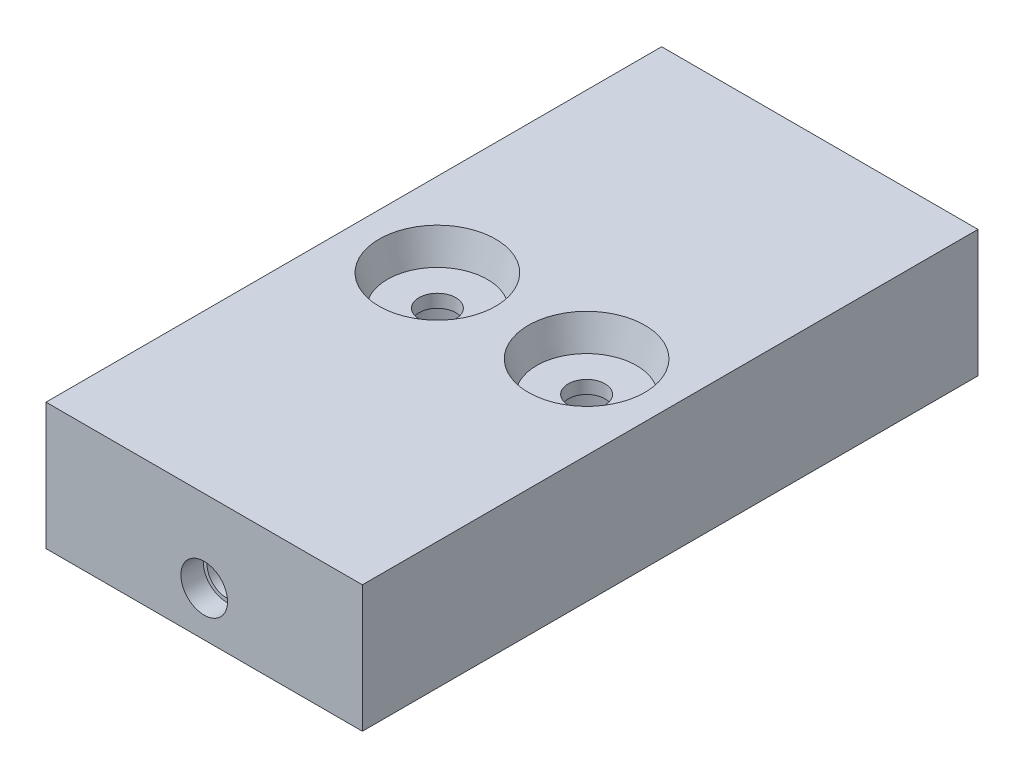
ISO-10303-21;
HEADER;
FILE_DESCRIPTION(('STEP AP214'),'2;1');
FILE_NAME('part.step','',(''),(''),'','','');
FILE_SCHEMA(('AUTOMOTIVE_DESIGN { 1 0 10303 214 1 1 1 1 }'));
ENDSEC;
DATA;
#1=APPLICATION_CONTEXT('core data for automotive mechanical design processes');
#2=APPLICATION_PROTOCOL_DEFINITION('international standard','automotive_design',2000,#1);
#3=PRODUCT_CONTEXT('',#1,'mechanical');
#4=PRODUCT('Part','Part','',(#3));
#5=PRODUCT_RELATED_PRODUCT_CATEGORY('part','',(#4));
#6=PRODUCT_DEFINITION_FORMATION('','',#4);
#7=PRODUCT_DEFINITION_CONTEXT('part definition',#1,'design');
#8=PRODUCT_DEFINITION('design','',#6,#7);
#9=PRODUCT_DEFINITION_SHAPE('','',#8);
#10=(LENGTH_UNIT() NAMED_UNIT(*) SI_UNIT(.MILLI.,.METRE.));
#11=(NAMED_UNIT(*) PLANE_ANGLE_UNIT() SI_UNIT($,.RADIAN.));
#12=(NAMED_UNIT(*) SI_UNIT($,.STERADIAN.) SOLID_ANGLE_UNIT());
#13=UNCERTAINTY_MEASURE_WITH_UNIT(LENGTH_MEASURE(1.E-05),#10,'distance_accuracy_value','');
#14=(GEOMETRIC_REPRESENTATION_CONTEXT(3) GLOBAL_UNCERTAINTY_ASSIGNED_CONTEXT((#13)) GLOBAL_UNIT_ASSIGNED_CONTEXT((#10,
#11,#12)) REPRESENTATION_CONTEXT('',''));
#15=CARTESIAN_POINT('',(0.,0.,0.));
#16=DIRECTION('',(0.,0.,1.));
#17=DIRECTION('',(1.,0.,0.));
#18=AXIS2_PLACEMENT_3D('',#15,#16,#17);
#19=CARTESIAN_POINT('',(0.,-1.75,0.));
#20=DIRECTION('',(0.,1.,0.));
#21=DIRECTION('',(0.,0.,1.));
#22=AXIS2_PLACEMENT_3D('',#19,#20,#21);
#23=PLANE('',#22);
#24=CARTESIAN_POINT('',(20.,-1.75,0.));
#25=DIRECTION('',(0.,1.,0.));
#26=DIRECTION('',(0.,0.,1.));
#27=AXIS2_PLACEMENT_3D('',#24,#25,#26);
#28=CIRCLE('',#27,4.92500000000001);
#29=CARTESIAN_POINT('',(20.,-1.75,4.92500000000001));
#30=VERTEX_POINT('',#29);
#31=EDGE_CURVE('E147',#30,#30,#28,.T.);
#32=ORIENTED_EDGE('',*,*,#31,.T.);
#33=EDGE_LOOP('',(#32));
#34=FACE_BOUND('',#33,.T.);
#35=CARTESIAN_POINT('',(20.,-1.75,0.));
#36=DIRECTION('',(0.,1.,0.));
#37=DIRECTION('',(0.,0.,1.));
#38=AXIS2_PLACEMENT_3D('',#35,#36,#37);
#39=CIRCLE('',#38,13.4);
#40=CARTESIAN_POINT('',(20.,-1.75,13.4));
#41=VERTEX_POINT('',#40);
#42=EDGE_CURVE('E131',#41,#41,#39,.F.);
#43=ORIENTED_EDGE('',*,*,#42,.T.);
#44=EDGE_LOOP('',(#43));
#45=FACE_BOUND('',#44,.T.);
#46=ADVANCED_FACE('F46',(#34,#45),#23,.F.);
#47=CARTESIAN_POINT('',(0.,1.75,0.));
#48=DIRECTION('',(0.,1.,0.));
#49=DIRECTION('',(0.,0.,1.));
#50=AXIS2_PLACEMENT_3D('',#47,#48,#49);
#51=PLANE('',#50);
#52=CARTESIAN_POINT('',(20.,1.75,0.));
#53=DIRECTION('',(0.,1.,0.));
#54=DIRECTION('',(0.,0.,1.));
#55=AXIS2_PLACEMENT_3D('',#52,#53,#54);
#56=CIRCLE('',#55,4.92500000000001);
#57=CARTESIAN_POINT('',(20.,1.75,4.92500000000001));
#58=VERTEX_POINT('',#57);
#59=EDGE_CURVE('E140',#58,#58,#56,.T.);
#60=ORIENTED_EDGE('',*,*,#59,.F.);
#61=EDGE_LOOP('',(#60));
#62=FACE_BOUND('',#61,.T.);
#63=CARTESIAN_POINT('',(20.,1.75,0.));
#64=DIRECTION('',(0.,1.,0.));
#65=DIRECTION('',(0.,0.,1.));
#66=AXIS2_PLACEMENT_3D('',#63,#64,#65);
#67=CIRCLE('',#66,13.4);
#68=CARTESIAN_POINT('',(20.,1.75,13.4));
#69=VERTEX_POINT('',#68);
#70=EDGE_CURVE('E150',#69,#69,#67,.T.);
#71=ORIENTED_EDGE('',*,*,#70,.T.);
#72=EDGE_LOOP('',(#71));
#73=FACE_BOUND('',#72,.T.);
#74=ADVANCED_FACE('F184',(#62,#73),#51,.T.);
#75=CARTESIAN_POINT('',(42.4,1.75,0.));
#76=DIRECTION('',(1.,0.,0.));
#77=DIRECTION('',(0.,0.,-1.));
#78=AXIS2_PLACEMENT_3D('',#75,#76,#77);
#79=PLANE('',#78);
#80=DIRECTION('',(0.,-1.,0.));
#81=VECTOR('',#80,1.);
#82=CARTESIAN_POINT('',(42.4,1.75,82.5));
#83=LINE('',#82,#81);
#84=CARTESIAN_POINT('',(42.4,10.,82.5));
#85=VERTEX_POINT('',#84);
#86=CARTESIAN_POINT('',(42.4,-24.,82.5));
#87=VERTEX_POINT('',#86);
#88=EDGE_CURVE('E63',#85,#87,#83,.T.);
#89=ORIENTED_EDGE('',*,*,#88,.T.);
#90=DIRECTION('',(0.,0.,1.));
#91=VECTOR('',#90,1.);
#92=CARTESIAN_POINT('',(42.4,-24.,0.));
#93=LINE('',#92,#91);
#94=CARTESIAN_POINT('',(42.4,-24.,-82.5));
#95=VERTEX_POINT('',#94);
#96=EDGE_CURVE('E111',#95,#87,#93,.T.);
#97=ORIENTED_EDGE('',*,*,#96,.F.);
#98=DIRECTION('',(0.,-1.,0.));
#99=VECTOR('',#98,1.);
#100=CARTESIAN_POINT('',(42.4,1.75,-82.5));
#101=LINE('',#100,#99);
#102=CARTESIAN_POINT('',(42.4,10.,-82.5));
#103=VERTEX_POINT('',#102);
#104=EDGE_CURVE('E93',#103,#95,#101,.T.);
#105=ORIENTED_EDGE('',*,*,#104,.F.);
#106=DIRECTION('',(0.,0.,1.));
#107=VECTOR('',#106,1.);
#108=CARTESIAN_POINT('',(42.4,10.,0.));
#109=LINE('',#108,#107);
#110=EDGE_CURVE('E132',#103,#85,#109,.T.);
#111=ORIENTED_EDGE('',*,*,#110,.T.);
#112=EDGE_LOOP('',(#89,#97,#105,#111));
#113=FACE_BOUND('',#112,.T.);
#114=ADVANCED_FACE('F114',(#113),#79,.T.);
#115=CARTESIAN_POINT('',(0.,1.75,-82.5));
#116=DIRECTION('',(0.,0.,-1.));
#117=DIRECTION('',(-1.,0.,0.));
#118=AXIS2_PLACEMENT_3D('',#115,#116,#117);
#119=PLANE('',#118);
#120=CARTESIAN_POINT('',(0.,-12.,-82.5));
#121=DIRECTION('',(0.,0.,1.));
#122=DIRECTION('',(1.,0.,0.));
#123=AXIS2_PLACEMENT_3D('',#120,#121,#122);
#124=CIRCLE('',#123,6.25);
#125=CARTESIAN_POINT('',(6.25,-12.,-82.5));
#126=VERTEX_POINT('',#125);
#127=EDGE_CURVE('E528',#126,#126,#124,.T.);
#128=ORIENTED_EDGE('',*,*,#127,.T.);
#129=EDGE_LOOP('',(#128));
#130=FACE_BOUND('',#129,.T.);
#131=ORIENTED_EDGE('',*,*,#104,.T.);
#132=DIRECTION('',(1.,0.,0.));
#133=VECTOR('',#132,1.);
#134=CARTESIAN_POINT('',(0.,-24.,-82.5));
#135=LINE('',#134,#133);
#136=CARTESIAN_POINT('',(-42.4,-24.,-82.5));
#137=VERTEX_POINT('',#136);
#138=EDGE_CURVE('E96',#137,#95,#135,.T.);
#139=ORIENTED_EDGE('',*,*,#138,.F.);
#140=DIRECTION('',(0.,-1.,0.));
#141=VECTOR('',#140,1.);
#142=CARTESIAN_POINT('',(-42.4,1.75,-82.5));
#143=LINE('',#142,#141);
#144=CARTESIAN_POINT('',(-42.4,10.,-82.5));
#145=VERTEX_POINT('',#144);
#146=EDGE_CURVE('E104',#145,#137,#143,.T.);
#147=ORIENTED_EDGE('',*,*,#146,.F.);
#148=DIRECTION('',(1.,0.,0.));
#149=VECTOR('',#148,1.);
#150=CARTESIAN_POINT('',(0.,10.,-82.5));
#151=LINE('',#150,#149);
#152=EDGE_CURVE('E99',#145,#103,#151,.T.);
#153=ORIENTED_EDGE('',*,*,#152,.T.);
#154=EDGE_LOOP('',(#131,#139,#147,#153));
#155=FACE_BOUND('',#154,.T.);
#156=ADVANCED_FACE('F95',(#130,#155),#119,.T.);
#157=CARTESIAN_POINT('',(-42.4,1.75,0.));
#158=DIRECTION('',(1.,0.,0.));
#159=DIRECTION('',(0.,0.,-1.));
#160=AXIS2_PLACEMENT_3D('',#157,#158,#159);
#161=PLANE('',#160);
#162=ORIENTED_EDGE('',*,*,#146,.T.);
#163=DIRECTION('',(0.,0.,1.));
#164=VECTOR('',#163,1.);
#165=CARTESIAN_POINT('',(-42.4,-24.,0.));
#166=LINE('',#165,#164);
#167=CARTESIAN_POINT('',(-42.4,-24.,82.5));
#168=VERTEX_POINT('',#167);
#169=EDGE_CURVE('E112',#137,#168,#166,.T.);
#170=ORIENTED_EDGE('',*,*,#169,.T.);
#171=DIRECTION('',(0.,-1.,0.));
#172=VECTOR('',#171,1.);
#173=CARTESIAN_POINT('',(-42.4,1.75,82.5));
#174=LINE('',#173,#172);
#175=CARTESIAN_POINT('',(-42.4,10.,82.5));
#176=VERTEX_POINT('',#175);
#177=EDGE_CURVE('E73',#176,#168,#174,.T.);
#178=ORIENTED_EDGE('',*,*,#177,.F.);
#179=DIRECTION('',(0.,0.,1.));
#180=VECTOR('',#179,1.);
#181=CARTESIAN_POINT('',(-42.4,10.,0.));
#182=LINE('',#181,#180);
#183=EDGE_CURVE('E135',#145,#176,#182,.T.);
#184=ORIENTED_EDGE('',*,*,#183,.F.);
#185=EDGE_LOOP('',(#162,#170,#178,#184));
#186=FACE_BOUND('',#185,.T.);
#187=ADVANCED_FACE('F217',(#186),#161,.F.);
#188=CARTESIAN_POINT('',(20.,1.75,0.));
#189=DIRECTION('',(0.,-1.,0.));
#190=DIRECTION('',(0.,0.,-1.));
#191=AXIS2_PLACEMENT_3D('',#188,#189,#190);
#192=CYLINDRICAL_SURFACE('',#191,4.92500000000001);
#193=ORIENTED_EDGE('',*,*,#59,.T.);
#194=EDGE_LOOP('',(#193));
#195=FACE_BOUND('',#194,.T.);
#196=ORIENTED_EDGE('',*,*,#31,.F.);
#197=EDGE_LOOP('',(#196));
#198=FACE_BOUND('',#197,.T.);
#199=ADVANCED_FACE('F212',(#195,#198),#192,.F.);
#200=CARTESIAN_POINT('',(0.,1.75,82.5));
#201=DIRECTION('',(0.,0.,-1.));
#202=DIRECTION('',(-1.,0.,0.));
#203=AXIS2_PLACEMENT_3D('',#200,#201,#202);
#204=PLANE('',#203);
#205=CARTESIAN_POINT('',(0.,-12.,82.5));
#206=DIRECTION('',(0.,0.,1.));
#207=DIRECTION('',(1.,0.,0.));
#208=AXIS2_PLACEMENT_3D('',#205,#206,#207);
#209=CIRCLE('',#208,6.25);
#210=CARTESIAN_POINT('',(6.25,-12.,82.5));
#211=VERTEX_POINT('',#210);
#212=EDGE_CURVE('E115',#211,#211,#209,.T.);
#213=ORIENTED_EDGE('',*,*,#212,.F.);
#214=EDGE_LOOP('',(#213));
#215=FACE_BOUND('',#214,.T.);
#216=ORIENTED_EDGE('',*,*,#177,.T.);
#217=DIRECTION('',(1.,0.,0.));
#218=VECTOR('',#217,1.);
#219=CARTESIAN_POINT('',(0.,-24.,82.5));
#220=LINE('',#219,#218);
#221=EDGE_CURVE('E123',#168,#87,#220,.T.);
#222=ORIENTED_EDGE('',*,*,#221,.T.);
#223=ORIENTED_EDGE('',*,*,#88,.F.);
#224=DIRECTION('',(1.,0.,0.));
#225=VECTOR('',#224,1.);
#226=CARTESIAN_POINT('',(0.,10.,82.5));
#227=LINE('',#226,#225);
#228=EDGE_CURVE('E137',#176,#85,#227,.T.);
#229=ORIENTED_EDGE('',*,*,#228,.F.);
#230=EDGE_LOOP('',(#216,#222,#223,#229));
#231=FACE_BOUND('',#230,.T.);
#232=ADVANCED_FACE('F207',(#215,#231),#204,.F.);
#233=CARTESIAN_POINT('',(-20.,1.75,0.));
#234=DIRECTION('',(0.,-1.,0.));
#235=DIRECTION('',(0.,0.,-1.));
#236=AXIS2_PLACEMENT_3D('',#233,#234,#235);
#237=CYLINDRICAL_SURFACE('',#236,4.925);
#238=CARTESIAN_POINT('',(-20.,1.75,0.));
#239=DIRECTION('',(0.,1.,0.));
#240=DIRECTION('',(0.,0.,1.));
#241=AXIS2_PLACEMENT_3D('',#238,#239,#240);
#242=CIRCLE('',#241,4.925);
#243=CARTESIAN_POINT('',(-20.,1.75,4.925));
#244=VERTEX_POINT('',#243);
#245=EDGE_CURVE('E143',#244,#244,#242,.T.);
#246=ORIENTED_EDGE('',*,*,#245,.T.);
#247=EDGE_LOOP('',(#246));
#248=FACE_BOUND('',#247,.T.);
#249=CARTESIAN_POINT('',(-20.,-1.75,0.));
#250=DIRECTION('',(0.,1.,0.));
#251=DIRECTION('',(0.,0.,1.));
#252=AXIS2_PLACEMENT_3D('',#249,#250,#251);
#253=CIRCLE('',#252,4.925);
#254=CARTESIAN_POINT('',(-20.,-1.75,4.925));
#255=VERTEX_POINT('',#254);
#256=EDGE_CURVE('E144',#255,#255,#253,.T.);
#257=ORIENTED_EDGE('',*,*,#256,.F.);
#258=EDGE_LOOP('',(#257));
#259=FACE_BOUND('',#258,.T.);
#260=ADVANCED_FACE('F200',(#248,#259),#237,.F.);
#261=CARTESIAN_POINT('',(-20.,1.75,0.));
#262=DIRECTION('',(0.,1.,0.));
#263=DIRECTION('',(0.,0.,1.));
#264=AXIS2_PLACEMENT_3D('',#261,#262,#263);
#265=CIRCLE('',#264,13.4);
#266=CARTESIAN_POINT('',(-20.,1.75,13.4));
#267=VERTEX_POINT('',#266);
#268=EDGE_CURVE('E55',#267,#267,#265,.F.);
#269=ORIENTED_EDGE('',*,*,#268,.F.);
#270=EDGE_LOOP('',(#269));
#271=FACE_BOUND('',#270,.T.);
#272=ORIENTED_EDGE('',*,*,#245,.F.);
#273=EDGE_LOOP('',(#272));
#274=FACE_BOUND('',#273,.T.);
#275=ADVANCED_FACE('F192',(#271,#274),#51,.T.);
#276=CARTESIAN_POINT('',(-20.,-1.75,0.));
#277=DIRECTION('',(0.,1.,0.));
#278=DIRECTION('',(0.,0.,1.));
#279=AXIS2_PLACEMENT_3D('',#276,#277,#278);
#280=CIRCLE('',#279,13.4);
#281=CARTESIAN_POINT('',(-20.,-1.75,13.4));
#282=VERTEX_POINT('',#281);
#283=EDGE_CURVE('E12',#282,#282,#280,.T.);
#284=ORIENTED_EDGE('',*,*,#283,.F.);
#285=EDGE_LOOP('',(#284));
#286=FACE_BOUND('',#285,.T.);
#287=ORIENTED_EDGE('',*,*,#256,.T.);
#288=EDGE_LOOP('',(#287));
#289=FACE_BOUND('',#288,.T.);
#290=ADVANCED_FACE('F180',(#286,#289),#23,.F.);
#291=CARTESIAN_POINT('',(-20.,1.75,0.));
#292=DIRECTION('',(0.,1.,0.));
#293=DIRECTION('',(0.,0.,1.));
#294=AXIS2_PLACEMENT_3D('',#291,#292,#293);
#295=CONICAL_SURFACE('',#294,13.4,0.26179938779915);
#296=ORIENTED_EDGE('',*,*,#268,.T.);
#297=EDGE_LOOP('',(#296));
#298=FACE_BOUND('',#297,.T.);
#299=CARTESIAN_POINT('',(-20.,10.,0.));
#300=DIRECTION('',(0.,1.,0.));
#301=DIRECTION('',(0.,0.,1.));
#302=AXIS2_PLACEMENT_3D('',#299,#300,#301);
#303=CIRCLE('',#302,15.6105808375568);
#304=CARTESIAN_POINT('',(-20.,10.,15.6105808375568));
#305=VERTEX_POINT('',#304);
#306=EDGE_CURVE('E139',#305,#305,#303,.T.);
#307=ORIENTED_EDGE('',*,*,#306,.T.);
#308=EDGE_LOOP('',(#307));
#309=FACE_BOUND('',#308,.T.);
#310=ADVANCED_FACE('F171',(#298,#309),#295,.F.);
#311=CARTESIAN_POINT('',(20.,1.75,0.));
#312=DIRECTION('',(0.,1.,0.));
#313=DIRECTION('',(0.,0.,1.));
#314=AXIS2_PLACEMENT_3D('',#311,#312,#313);
#315=CONICAL_SURFACE('',#314,13.4,0.26179938779915);
#316=ORIENTED_EDGE('',*,*,#70,.F.);
#317=EDGE_LOOP('',(#316));
#318=FACE_BOUND('',#317,.T.);
#319=CARTESIAN_POINT('',(20.,10.,0.));
#320=DIRECTION('',(0.,1.,0.));
#321=DIRECTION('',(0.,0.,1.));
#322=AXIS2_PLACEMENT_3D('',#319,#320,#321);
#323=CIRCLE('',#322,15.6105808375568);
#324=CARTESIAN_POINT('',(20.,10.,15.6105808375568));
#325=VERTEX_POINT('',#324);
#326=EDGE_CURVE('E50',#325,#325,#323,.F.);
#327=ORIENTED_EDGE('',*,*,#326,.F.);
#328=EDGE_LOOP('',(#327));
#329=FACE_BOUND('',#328,.T.);
#330=ADVANCED_FACE('F48',(#318,#329),#315,.F.);
#331=CARTESIAN_POINT('',(0.,10.,0.));
#332=DIRECTION('',(0.,1.,0.));
#333=DIRECTION('',(0.,0.,1.));
#334=AXIS2_PLACEMENT_3D('',#331,#332,#333);
#335=PLANE('',#334);
#336=ORIENTED_EDGE('',*,*,#110,.F.);
#337=ORIENTED_EDGE('',*,*,#152,.F.);
#338=ORIENTED_EDGE('',*,*,#183,.T.);
#339=ORIENTED_EDGE('',*,*,#228,.T.);
#340=EDGE_LOOP('',(#336,#337,#338,#339));
#341=FACE_BOUND('',#340,.T.);
#342=ORIENTED_EDGE('',*,*,#306,.F.);
#343=EDGE_LOOP('',(#342));
#344=FACE_BOUND('',#343,.T.);
#345=ORIENTED_EDGE('',*,*,#326,.T.);
#346=EDGE_LOOP('',(#345));
#347=FACE_BOUND('',#346,.T.);
#348=ADVANCED_FACE('F168',(#341,#344,#347),#335,.T.);
#349=CARTESIAN_POINT('',(-20.,-24.,0.));
#350=DIRECTION('',(0.,1.,0.));
#351=DIRECTION('',(0.,0.,1.));
#352=AXIS2_PLACEMENT_3D('',#349,#350,#351);
#353=CYLINDRICAL_SURFACE('',#352,13.4);
#354=CARTESIAN_POINT('',(-20.,-24.,0.));
#355=DIRECTION('',(0.,1.,0.));
#356=DIRECTION('',(0.,0.,1.));
#357=AXIS2_PLACEMENT_3D('',#354,#355,#356);
#358=CIRCLE('',#357,13.4);
#359=CARTESIAN_POINT('',(-20.,-24.,13.4));
#360=VERTEX_POINT('',#359);
#361=EDGE_CURVE('E125',#360,#360,#358,.T.);
#362=ORIENTED_EDGE('',*,*,#361,.F.);
#363=EDGE_LOOP('',(#362));
#364=FACE_BOUND('',#363,.T.);
#365=ORIENTED_EDGE('',*,*,#283,.T.);
#366=EDGE_LOOP('',(#365));
#367=FACE_BOUND('',#366,.T.);
#368=ADVANCED_FACE('F177',(#364,#367),#353,.F.);
#369=CARTESIAN_POINT('',(20.,-24.,0.));
#370=DIRECTION('',(0.,1.,0.));
#371=DIRECTION('',(0.,0.,1.));
#372=AXIS2_PLACEMENT_3D('',#369,#370,#371);
#373=CYLINDRICAL_SURFACE('',#372,13.4);
#374=CARTESIAN_POINT('',(20.,-24.,0.));
#375=DIRECTION('',(0.,1.,0.));
#376=DIRECTION('',(0.,0.,1.));
#377=AXIS2_PLACEMENT_3D('',#374,#375,#376);
#378=CIRCLE('',#377,13.4);
#379=CARTESIAN_POINT('',(20.,-24.,13.4));
#380=VERTEX_POINT('',#379);
#381=EDGE_CURVE('E128',#380,#380,#378,.F.);
#382=ORIENTED_EDGE('',*,*,#381,.T.);
#383=EDGE_LOOP('',(#382));
#384=FACE_BOUND('',#383,.T.);
#385=ORIENTED_EDGE('',*,*,#42,.F.);
#386=EDGE_LOOP('',(#385));
#387=FACE_BOUND('',#386,.T.);
#388=ADVANCED_FACE('F394',(#384,#387),#373,.F.);
#389=CARTESIAN_POINT('',(0.,-24.,0.));
#390=DIRECTION('',(0.,1.,0.));
#391=DIRECTION('',(0.,0.,1.));
#392=AXIS2_PLACEMENT_3D('',#389,#390,#391);
#393=PLANE('',#392);
#394=ORIENTED_EDGE('',*,*,#96,.T.);
#395=ORIENTED_EDGE('',*,*,#221,.F.);
#396=ORIENTED_EDGE('',*,*,#169,.F.);
#397=ORIENTED_EDGE('',*,*,#138,.T.);
#398=EDGE_LOOP('',(#394,#395,#396,#397));
#399=FACE_BOUND('',#398,.T.);
#400=ORIENTED_EDGE('',*,*,#361,.T.);
#401=EDGE_LOOP('',(#400));
#402=FACE_BOUND('',#401,.T.);
#403=ORIENTED_EDGE('',*,*,#381,.F.);
#404=EDGE_LOOP('',(#403));
#405=FACE_BOUND('',#404,.T.);
#406=ADVANCED_FACE('F108',(#399,#402,#405),#393,.F.);
#407=CARTESIAN_POINT('',(0.,-12.,82.5));
#408=DIRECTION('',(0.,0.,1.));
#409=DIRECTION('',(1.,0.,0.));
#410=AXIS2_PLACEMENT_3D('',#407,#408,#409);
#411=CYLINDRICAL_SURFACE('',#410,6.25);
#412=ORIENTED_EDGE('',*,*,#212,.T.);
#413=EDGE_LOOP('',(#412));
#414=FACE_BOUND('',#413,.T.);
#415=CARTESIAN_POINT('',(0.,-12.,76.5));
#416=DIRECTION('',(0.,0.,1.));
#417=DIRECTION('',(1.,0.,0.));
#418=AXIS2_PLACEMENT_3D('',#415,#416,#417);
#419=CIRCLE('',#418,6.25);
#420=CARTESIAN_POINT('',(6.25,-12.,76.5));
#421=VERTEX_POINT('',#420);
#422=EDGE_CURVE('E118',#421,#421,#419,.T.);
#423=ORIENTED_EDGE('',*,*,#422,.F.);
#424=EDGE_LOOP('',(#423));
#425=FACE_BOUND('',#424,.T.);
#426=ADVANCED_FACE('F260',(#414,#425),#411,.F.);
#427=CARTESIAN_POINT('',(-6.25,-12.,76.5));
#428=DIRECTION('',(0.,0.,1.));
#429=DIRECTION('',(1.,0.,0.));
#430=AXIS2_PLACEMENT_3D('',#427,#428,#429);
#431=PLANE('',#430);
#432=ORIENTED_EDGE('',*,*,#422,.T.);
#433=EDGE_LOOP('',(#432));
#434=FACE_BOUND('',#433,.T.);
#435=CARTESIAN_POINT('',(0.,-12.,76.5));
#436=DIRECTION('',(0.,0.,1.));
#437=DIRECTION('',(1.,0.,0.));
#438=AXIS2_PLACEMENT_3D('',#435,#436,#437);
#439=CIRCLE('',#438,5.25);
#440=CARTESIAN_POINT('',(5.25,-12.,76.5));
#441=VERTEX_POINT('',#440);
#442=EDGE_CURVE('E540',#441,#441,#439,.T.);
#443=ORIENTED_EDGE('',*,*,#442,.F.);
#444=EDGE_LOOP('',(#443));
#445=FACE_BOUND('',#444,.T.);
#446=ADVANCED_FACE('F265',(#434,#445),#431,.T.);
#447=CARTESIAN_POINT('',(0.,-12.,82.5));
#448=DIRECTION('',(0.,0.,1.));
#449=DIRECTION('',(1.,0.,0.));
#450=AXIS2_PLACEMENT_3D('',#447,#448,#449);
#451=CYLINDRICAL_SURFACE('',#450,5.25);
#452=ORIENTED_EDGE('',*,*,#442,.T.);
#453=EDGE_LOOP('',(#452));
#454=FACE_BOUND('',#453,.T.);
#455=CARTESIAN_POINT('',(0.,-12.,61.5));
#456=DIRECTION('',(0.,0.,1.));
#457=DIRECTION('',(1.,0.,0.));
#458=AXIS2_PLACEMENT_3D('',#455,#456,#457);
#459=CIRCLE('',#458,5.25);
#460=CARTESIAN_POINT('',(5.25,-12.,61.5));
#461=VERTEX_POINT('',#460);
#462=EDGE_CURVE('E537',#461,#461,#459,.T.);
#463=ORIENTED_EDGE('',*,*,#462,.F.);
#464=EDGE_LOOP('',(#463));
#465=FACE_BOUND('',#464,.T.);
#466=ADVANCED_FACE('F275',(#454,#465),#451,.F.);
#467=CARTESIAN_POINT('',(-5.25,-12.,61.5));
#468=DIRECTION('',(0.,0.,1.));
#469=DIRECTION('',(1.,0.,0.));
#470=AXIS2_PLACEMENT_3D('',#467,#468,#469);
#471=PLANE('',#470);
#472=ORIENTED_EDGE('',*,*,#462,.T.);
#473=EDGE_LOOP('',(#472));
#474=FACE_BOUND('',#473,.T.);
#475=CARTESIAN_POINT('',(0.,-12.,61.5));
#476=DIRECTION('',(0.,0.,1.));
#477=DIRECTION('',(1.,0.,0.));
#478=AXIS2_PLACEMENT_3D('',#475,#476,#477);
#479=CIRCLE('',#478,4.05);
#480=CARTESIAN_POINT('',(4.05,-12.,61.5));
#481=VERTEX_POINT('',#480);
#482=EDGE_CURVE('E534',#481,#481,#479,.T.);
#483=ORIENTED_EDGE('',*,*,#482,.F.);
#484=EDGE_LOOP('',(#483));
#485=FACE_BOUND('',#484,.T.);
#486=ADVANCED_FACE('F285',(#474,#485),#471,.T.);
#487=CARTESIAN_POINT('',(0.,-12.,82.5));
#488=DIRECTION('',(0.,0.,1.));
#489=DIRECTION('',(1.,0.,0.));
#490=AXIS2_PLACEMENT_3D('',#487,#488,#489);
#491=CYLINDRICAL_SURFACE('',#490,4.05);
#492=ORIENTED_EDGE('',*,*,#482,.T.);
#493=EDGE_LOOP('',(#492));
#494=FACE_BOUND('',#493,.T.);
#495=CARTESIAN_POINT('',(0.,-12.,47.5));
#496=DIRECTION('',(0.,0.,1.));
#497=DIRECTION('',(1.,0.,0.));
#498=AXIS2_PLACEMENT_3D('',#495,#496,#497);
#499=CIRCLE('',#498,4.05);
#500=CARTESIAN_POINT('',(4.05,-12.,47.5));
#501=VERTEX_POINT('',#500);
#502=EDGE_CURVE('E531',#501,#501,#499,.T.);
#503=ORIENTED_EDGE('',*,*,#502,.F.);
#504=EDGE_LOOP('',(#503));
#505=FACE_BOUND('',#504,.T.);
#506=ADVANCED_FACE('F295',(#494,#505),#491,.F.);
#507=CARTESIAN_POINT('',(-4.05,-12.,47.5));
#508=DIRECTION('',(0.,0.,1.));
#509=DIRECTION('',(1.,0.,0.));
#510=AXIS2_PLACEMENT_3D('',#507,#508,#509);
#511=PLANE('',#510);
#512=ORIENTED_EDGE('',*,*,#502,.T.);
#513=EDGE_LOOP('',(#512));
#514=FACE_BOUND('',#513,.T.);
#515=ADVANCED_FACE('F304',(#514),#511,.T.);
#516=CARTESIAN_POINT('',(0.,-12.,-82.5));
#517=DIRECTION('',(0.,0.,-1.));
#518=DIRECTION('',(1.,0.,0.));
#519=AXIS2_PLACEMENT_3D('',#516,#517,#518);
#520=CYLINDRICAL_SURFACE('',#519,6.25);
#521=ORIENTED_EDGE('',*,*,#127,.F.);
#522=EDGE_LOOP('',(#521));
#523=FACE_BOUND('',#522,.T.);
#524=CARTESIAN_POINT('',(0.,-12.,-76.5));
#525=DIRECTION('',(0.,0.,1.));
#526=DIRECTION('',(1.,0.,0.));
#527=AXIS2_PLACEMENT_3D('',#524,#525,#526);
#528=CIRCLE('',#527,6.25);
#529=CARTESIAN_POINT('',(6.25,-12.,-76.5));
#530=VERTEX_POINT('',#529);
#531=EDGE_CURVE('E525',#530,#530,#528,.T.);
#532=ORIENTED_EDGE('',*,*,#531,.T.);
#533=EDGE_LOOP('',(#532));
#534=FACE_BOUND('',#533,.T.);
#535=ADVANCED_FACE('F313',(#523,#534),#520,.F.);
#536=CARTESIAN_POINT('',(-6.25,-12.,-76.5));
#537=DIRECTION('',(0.,0.,-1.));
#538=DIRECTION('',(1.,0.,0.));
#539=AXIS2_PLACEMENT_3D('',#536,#537,#538);
#540=PLANE('',#539);
#541=ORIENTED_EDGE('',*,*,#531,.F.);
#542=EDGE_LOOP('',(#541));
#543=FACE_BOUND('',#542,.T.);
#544=CARTESIAN_POINT('',(0.,-12.,-76.5));
#545=DIRECTION('',(0.,0.,1.));
#546=DIRECTION('',(1.,0.,0.));
#547=AXIS2_PLACEMENT_3D('',#544,#545,#546);
#548=CIRCLE('',#547,5.25);
#549=CARTESIAN_POINT('',(5.25,-12.,-76.5));
#550=VERTEX_POINT('',#549);
#551=EDGE_CURVE('E522',#550,#550,#548,.T.);
#552=ORIENTED_EDGE('',*,*,#551,.T.);
#553=EDGE_LOOP('',(#552));
#554=FACE_BOUND('',#553,.T.);
#555=ADVANCED_FACE('F324',(#543,#554),#540,.T.);
#556=CARTESIAN_POINT('',(0.,-12.,-82.5));
#557=DIRECTION('',(0.,0.,-1.));
#558=DIRECTION('',(1.,0.,0.));
#559=AXIS2_PLACEMENT_3D('',#556,#557,#558);
#560=CYLINDRICAL_SURFACE('',#559,5.25);
#561=ORIENTED_EDGE('',*,*,#551,.F.);
#562=EDGE_LOOP('',(#561));
#563=FACE_BOUND('',#562,.T.);
#564=CARTESIAN_POINT('',(0.,-12.,-61.5));
#565=DIRECTION('',(0.,0.,1.));
#566=DIRECTION('',(1.,0.,0.));
#567=AXIS2_PLACEMENT_3D('',#564,#565,#566);
#568=CIRCLE('',#567,5.25);
#569=CARTESIAN_POINT('',(5.25,-12.,-61.5));
#570=VERTEX_POINT('',#569);
#571=EDGE_CURVE('E517',#570,#570,#568,.T.);
#572=ORIENTED_EDGE('',*,*,#571,.T.);
#573=EDGE_LOOP('',(#572));
#574=FACE_BOUND('',#573,.T.);
#575=ADVANCED_FACE('F333',(#563,#574),#560,.F.);
#576=CARTESIAN_POINT('',(-5.25,-12.,-61.5));
#577=DIRECTION('',(0.,0.,-1.));
#578=DIRECTION('',(1.,0.,0.));
#579=AXIS2_PLACEMENT_3D('',#576,#577,#578);
#580=PLANE('',#579);
#581=ORIENTED_EDGE('',*,*,#571,.F.);
#582=EDGE_LOOP('',(#581));
#583=FACE_BOUND('',#582,.T.);
#584=CARTESIAN_POINT('',(0.,-12.,-61.5));
#585=DIRECTION('',(0.,0.,1.));
#586=DIRECTION('',(1.,0.,0.));
#587=AXIS2_PLACEMENT_3D('',#584,#585,#586);
#588=CIRCLE('',#587,4.05);
#589=CARTESIAN_POINT('',(4.05,-12.,-61.5));
#590=VERTEX_POINT('',#589);
#591=EDGE_CURVE('E514',#590,#590,#588,.T.);
#592=ORIENTED_EDGE('',*,*,#591,.T.);
#593=EDGE_LOOP('',(#592));
#594=FACE_BOUND('',#593,.T.);
#595=ADVANCED_FACE('F342',(#583,#594),#580,.T.);
#596=CARTESIAN_POINT('',(0.,-12.,-82.5));
#597=DIRECTION('',(0.,0.,-1.));
#598=DIRECTION('',(1.,0.,0.));
#599=AXIS2_PLACEMENT_3D('',#596,#597,#598);
#600=CYLINDRICAL_SURFACE('',#599,4.05);
#601=ORIENTED_EDGE('',*,*,#591,.F.);
#602=EDGE_LOOP('',(#601));
#603=FACE_BOUND('',#602,.T.);
#604=CARTESIAN_POINT('',(0.,-12.,-47.5));
#605=DIRECTION('',(0.,0.,1.));
#606=DIRECTION('',(1.,0.,0.));
#607=AXIS2_PLACEMENT_3D('',#604,#605,#606);
#608=CIRCLE('',#607,4.05);
#609=CARTESIAN_POINT('',(4.05,-12.,-47.5));
#610=VERTEX_POINT('',#609);
#611=EDGE_CURVE('E512',#610,#610,#608,.T.);
#612=ORIENTED_EDGE('',*,*,#611,.T.);
#613=EDGE_LOOP('',(#612));
#614=FACE_BOUND('',#613,.T.);
#615=ADVANCED_FACE('F349',(#603,#614),#600,.F.);
#616=CARTESIAN_POINT('',(-4.05,-12.,-47.5));
#617=DIRECTION('',(0.,0.,-1.));
#618=DIRECTION('',(1.,0.,0.));
#619=AXIS2_PLACEMENT_3D('',#616,#617,#618);
#620=PLANE('',#619);
#621=ORIENTED_EDGE('',*,*,#611,.F.);
#622=EDGE_LOOP('',(#621));
#623=FACE_BOUND('',#622,.T.);
#624=ADVANCED_FACE('F357',(#623),#620,.T.);
#625=CLOSED_SHELL('',(#46,#74,#114,#156,#187,#199,#232,#260,#275,#290,#310,#330,#348,#368,#388,
#406,#426,#446,#466,#486,#506,#515,#535,#555,#575,#595,#615,#624));
#626=MANIFOLD_SOLID_BREP('B2',#625);
#627=ADVANCED_BREP_SHAPE_REPRESENTATION('',(#18,#626),#14);
#628=SHAPE_DEFINITION_REPRESENTATION(#9,#627);
ENDSEC;
END-ISO-10303-21;
